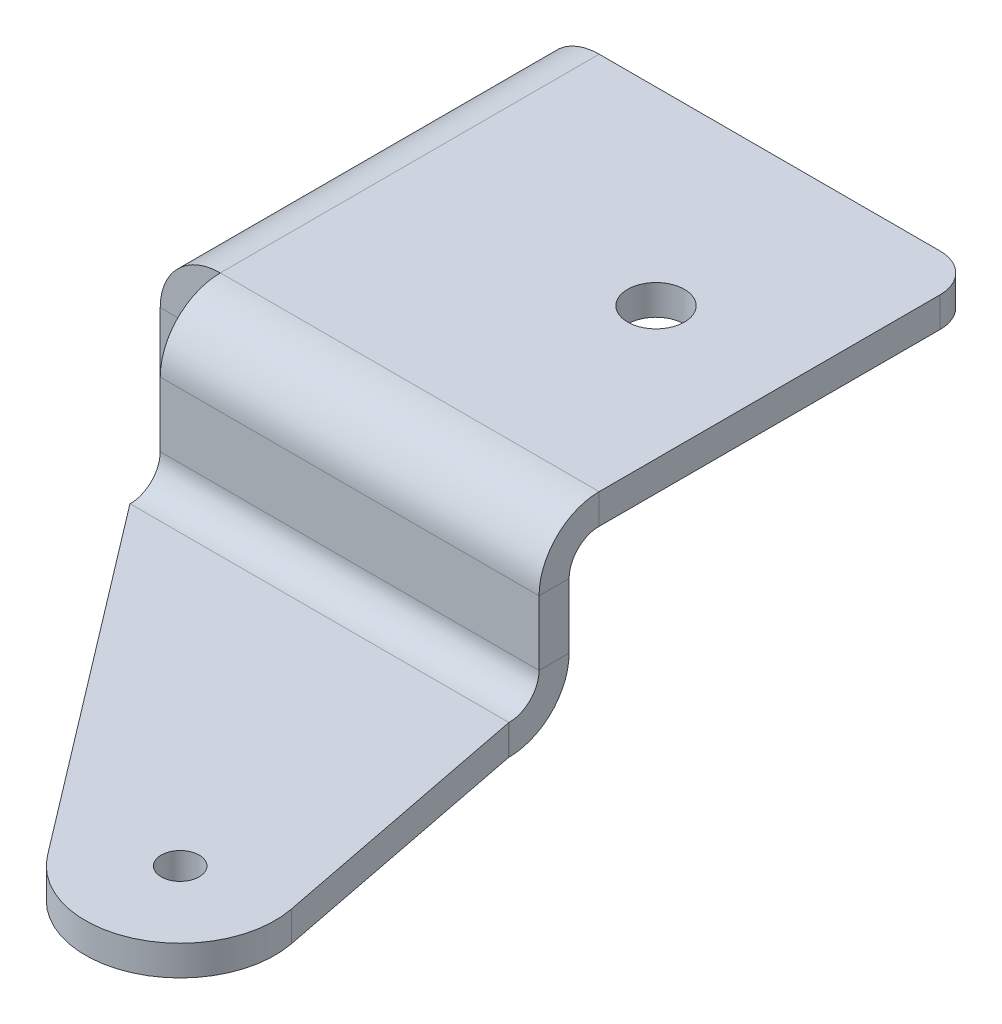
ISO-10303-21;
HEADER;
FILE_DESCRIPTION(('STEP AP214'),'2;1');
FILE_NAME('part.step','',(''),(''),'','','');
FILE_SCHEMA(('AUTOMOTIVE_DESIGN { 1 0 10303 214 1 1 1 1 }'));
ENDSEC;
DATA;
#1=APPLICATION_CONTEXT('core data for automotive mechanical design processes');
#2=APPLICATION_PROTOCOL_DEFINITION('international standard','automotive_design',2000,#1);
#3=PRODUCT_CONTEXT('',#1,'mechanical');
#4=PRODUCT('Part','Part','',(#3));
#5=PRODUCT_RELATED_PRODUCT_CATEGORY('part','',(#4));
#6=PRODUCT_DEFINITION_FORMATION('','',#4);
#7=PRODUCT_DEFINITION_CONTEXT('part definition',#1,'design');
#8=PRODUCT_DEFINITION('design','',#6,#7);
#9=PRODUCT_DEFINITION_SHAPE('','',#8);
#10=(LENGTH_UNIT() NAMED_UNIT(*) SI_UNIT(.MILLI.,.METRE.));
#11=(NAMED_UNIT(*) PLANE_ANGLE_UNIT() SI_UNIT($,.RADIAN.));
#12=(NAMED_UNIT(*) SI_UNIT($,.STERADIAN.) SOLID_ANGLE_UNIT());
#13=UNCERTAINTY_MEASURE_WITH_UNIT(LENGTH_MEASURE(1.E-05),#10,'distance_accuracy_value','');
#14=(GEOMETRIC_REPRESENTATION_CONTEXT(3) GLOBAL_UNCERTAINTY_ASSIGNED_CONTEXT((#13)) GLOBAL_UNIT_ASSIGNED_CONTEXT((#10,
#11,#12)) REPRESENTATION_CONTEXT('',''));
#15=CARTESIAN_POINT('',(0.,0.,0.));
#16=DIRECTION('',(0.,0.,1.));
#17=DIRECTION('',(1.,0.,0.));
#18=AXIS2_PLACEMENT_3D('',#15,#16,#17);
#19=CARTESIAN_POINT('',(20.,1.27,0.));
#20=DIRECTION('',(-1.,0.,0.));
#21=DIRECTION('',(0.,0.,-1.));
#22=AXIS2_PLACEMENT_3D('',#19,#20,#21);
#23=PLANE('',#22);
#24=DIRECTION('',(0.,0.,-1.));
#25=VECTOR('',#24,1.);
#26=CARTESIAN_POINT('',(20.,-0.3175,0.));
#27=LINE('',#26,#25);
#28=CARTESIAN_POINT('',(20.,-0.317499999999995,0.));
#29=VERTEX_POINT('',#28);
#30=CARTESIAN_POINT('',(20.,-0.3175,-18.));
#31=VERTEX_POINT('',#30);
#32=EDGE_CURVE('E489',#29,#31,#27,.T.);
#33=ORIENTED_EDGE('',*,*,#32,.T.);
#34=DIRECTION('',(0.,-1.,0.));
#35=VECTOR('',#34,1.);
#36=CARTESIAN_POINT('',(20.,1.27,-18.));
#37=LINE('',#36,#35);
#38=CARTESIAN_POINT('',(20.,1.27,-18.));
#39=VERTEX_POINT('',#38);
#40=EDGE_CURVE('E503',#31,#39,#37,.F.);
#41=ORIENTED_EDGE('',*,*,#40,.T.);
#42=DIRECTION('',(0.,0.,-1.));
#43=VECTOR('',#42,1.);
#44=CARTESIAN_POINT('',(20.,1.27,0.));
#45=LINE('',#44,#43);
#46=CARTESIAN_POINT('',(20.,1.27,0.));
#47=VERTEX_POINT('',#46);
#48=EDGE_CURVE('E471',#47,#39,#45,.T.);
#49=ORIENTED_EDGE('',*,*,#48,.F.);
#50=DIRECTION('',(0.,1.,0.));
#51=VECTOR('',#50,1.);
#52=CARTESIAN_POINT('',(20.,1.27,0.));
#53=LINE('',#52,#51);
#54=EDGE_CURVE('E499',#29,#47,#53,.T.);
#55=ORIENTED_EDGE('',*,*,#54,.F.);
#56=EDGE_LOOP('',(#33,#41,#49,#55));
#57=FACE_BOUND('',#56,.T.);
#58=ADVANCED_FACE('F109',(#57),#23,.F.);
#59=CARTESIAN_POINT('',(0.,1.27,-20.));
#60=DIRECTION('',(0.,0.,1.));
#61=DIRECTION('',(-1.,0.,0.));
#62=AXIS2_PLACEMENT_3D('',#59,#60,#61);
#63=PLANE('',#62);
#64=DIRECTION('',(-1.,0.,0.));
#65=VECTOR('',#64,1.);
#66=CARTESIAN_POINT('',(0.,1.27,-20.));
#67=LINE('',#66,#65);
#68=CARTESIAN_POINT('',(18.,1.27,-20.));
#69=VERTEX_POINT('',#68);
#70=CARTESIAN_POINT('',(0.,1.27,-20.));
#71=VERTEX_POINT('',#70);
#72=EDGE_CURVE('E475',#69,#71,#67,.T.);
#73=ORIENTED_EDGE('',*,*,#72,.F.);
#74=DIRECTION('',(0.,-1.,0.));
#75=VECTOR('',#74,1.);
#76=CARTESIAN_POINT('',(18.,1.27,-20.));
#77=LINE('',#76,#75);
#78=CARTESIAN_POINT('',(18.,-0.3175,-20.));
#79=VERTEX_POINT('',#78);
#80=EDGE_CURVE('E513',#69,#79,#77,.T.);
#81=ORIENTED_EDGE('',*,*,#80,.T.);
#82=DIRECTION('',(1.,0.,0.));
#83=VECTOR('',#82,1.);
#84=CARTESIAN_POINT('',(0.,-0.3175,-20.));
#85=LINE('',#84,#83);
#86=CARTESIAN_POINT('',(0.,-0.317499999999999,-20.));
#87=VERTEX_POINT('',#86);
#88=EDGE_CURVE('E463',#79,#87,#85,.F.);
#89=ORIENTED_EDGE('',*,*,#88,.T.);
#90=DIRECTION('',(0.,1.,0.));
#91=VECTOR('',#90,1.);
#92=CARTESIAN_POINT('',(0.,1.27,-20.));
#93=LINE('',#92,#91);
#94=EDGE_CURVE('E495',#87,#71,#93,.T.);
#95=ORIENTED_EDGE('',*,*,#94,.T.);
#96=EDGE_LOOP('',(#73,#81,#89,#95));
#97=FACE_BOUND('',#96,.T.);
#98=ADVANCED_FACE('F668',(#97),#63,.F.);
#99=CARTESIAN_POINT('',(13.,1.27,-10.));
#100=DIRECTION('',(0.,-1.,0.));
#101=DIRECTION('',(0.,0.,-1.));
#102=AXIS2_PLACEMENT_3D('',#99,#100,#101);
#103=CYLINDRICAL_SURFACE('',#102,1.5);
#104=CARTESIAN_POINT('',(13.,1.27,-10.));
#105=DIRECTION('',(0.,1.,0.));
#106=DIRECTION('',(0.,0.,1.));
#107=AXIS2_PLACEMENT_3D('',#104,#105,#106);
#108=CIRCLE('',#107,1.5);
#109=CARTESIAN_POINT('',(13.,1.27,-8.5));
#110=VERTEX_POINT('',#109);
#111=EDGE_CURVE('E458',#110,#110,#108,.T.);
#112=ORIENTED_EDGE('',*,*,#111,.T.);
#113=EDGE_LOOP('',(#112));
#114=FACE_BOUND('',#113,.T.);
#115=CARTESIAN_POINT('',(13.,-0.3175,-10.));
#116=DIRECTION('',(0.,1.,0.));
#117=DIRECTION('',(0.,0.,1.));
#118=AXIS2_PLACEMENT_3D('',#115,#116,#117);
#119=CIRCLE('',#118,1.5);
#120=CARTESIAN_POINT('',(13.,-0.3175,-8.5));
#121=VERTEX_POINT('',#120);
#122=EDGE_CURVE('E446',#121,#121,#119,.T.);
#123=ORIENTED_EDGE('',*,*,#122,.F.);
#124=EDGE_LOOP('',(#123));
#125=FACE_BOUND('',#124,.T.);
#126=ADVANCED_FACE('F674',(#114,#125),#103,.F.);
#127=CARTESIAN_POINT('',(0.,1.27,0.));
#128=DIRECTION('',(0.,-1.,0.));
#129=DIRECTION('',(0.,0.,-1.));
#130=AXIS2_PLACEMENT_3D('',#127,#128,#129);
#131=PLANE('',#130);
#132=ORIENTED_EDGE('',*,*,#111,.F.);
#133=EDGE_LOOP('',(#132));
#134=FACE_BOUND('',#133,.T.);
#135=ORIENTED_EDGE('',*,*,#48,.T.);
#136=CARTESIAN_POINT('',(18.,1.27,-18.));
#137=DIRECTION('',(0.,-1.,0.));
#138=DIRECTION('',(0.,0.,-1.));
#139=AXIS2_PLACEMENT_3D('',#136,#137,#138);
#140=CIRCLE('',#139,2.);
#141=EDGE_CURVE('E510',#39,#69,#140,.F.);
#142=ORIENTED_EDGE('',*,*,#141,.T.);
#143=ORIENTED_EDGE('',*,*,#72,.T.);
#144=DIRECTION('',(0.,0.,1.));
#145=VECTOR('',#144,1.);
#146=CARTESIAN_POINT('',(0.,1.27,0.));
#147=LINE('',#146,#145);
#148=CARTESIAN_POINT('',(0.,1.27000000000001,0.));
#149=VERTEX_POINT('',#148);
#150=EDGE_CURVE('E462',#71,#149,#147,.T.);
#151=ORIENTED_EDGE('',*,*,#150,.T.);
#152=DIRECTION('',(1.,0.,0.));
#153=VECTOR('',#152,1.);
#154=CARTESIAN_POINT('',(0.,1.27,0.));
#155=LINE('',#154,#153);
#156=EDGE_CURVE('E467',#149,#47,#155,.T.);
#157=ORIENTED_EDGE('',*,*,#156,.T.);
#158=EDGE_LOOP('',(#135,#142,#143,#151,#157));
#159=FACE_BOUND('',#158,.T.);
#160=ADVANCED_FACE('F589',(#134,#159),#131,.F.);
#161=CARTESIAN_POINT('',(0.,-0.3175,0.));
#162=DIRECTION('',(0.,-1.,0.));
#163=DIRECTION('',(0.,0.,-1.));
#164=AXIS2_PLACEMENT_3D('',#161,#162,#163);
#165=PLANE('',#164);
#166=ORIENTED_EDGE('',*,*,#122,.T.);
#167=EDGE_LOOP('',(#166));
#168=FACE_BOUND('',#167,.T.);
#169=ORIENTED_EDGE('',*,*,#88,.F.);
#170=CARTESIAN_POINT('',(18.,-0.3175,-18.));
#171=DIRECTION('',(0.,-1.,0.));
#172=DIRECTION('',(0.,0.,-1.));
#173=AXIS2_PLACEMENT_3D('',#170,#171,#172);
#174=CIRCLE('',#173,2.);
#175=EDGE_CURVE('E516',#79,#31,#174,.T.);
#176=ORIENTED_EDGE('',*,*,#175,.T.);
#177=ORIENTED_EDGE('',*,*,#32,.F.);
#178=DIRECTION('',(1.,0.,0.));
#179=VECTOR('',#178,1.);
#180=CARTESIAN_POINT('',(0.,-0.3175,0.));
#181=LINE('',#180,#179);
#182=CARTESIAN_POINT('',(0.,-0.317499999999995,0.));
#183=VERTEX_POINT('',#182);
#184=EDGE_CURVE('E486',#183,#29,#181,.T.);
#185=ORIENTED_EDGE('',*,*,#184,.F.);
#186=DIRECTION('',(0.,0.,-1.));
#187=VECTOR('',#186,1.);
#188=CARTESIAN_POINT('',(0.,-0.3175,0.));
#189=LINE('',#188,#187);
#190=EDGE_CURVE('E482',#87,#183,#189,.F.);
#191=ORIENTED_EDGE('',*,*,#190,.F.);
#192=EDGE_LOOP('',(#169,#176,#177,#185,#191));
#193=FACE_BOUND('',#192,.T.);
#194=ADVANCED_FACE('F576',(#168,#193),#165,.T.);
#195=CARTESIAN_POINT('',(0.,-1.905,0.));
#196=DIRECTION('',(0.,0.,1.));
#197=DIRECTION('',(1.,0.,0.));
#198=AXIS2_PLACEMENT_3D('',#195,#196,#197);
#199=PLANE('',#198);
#200=DIRECTION('',(1.,0.,0.));
#201=VECTOR('',#200,1.);
#202=CARTESIAN_POINT('',(-3.175,-1.90499999999999,0.));
#203=LINE('',#202,#201);
#204=CARTESIAN_POINT('',(-1.5875,-1.90499999999999,0.));
#205=VERTEX_POINT('',#204);
#206=CARTESIAN_POINT('',(-3.175,-1.90499999999999,0.));
#207=VERTEX_POINT('',#206);
#208=EDGE_CURVE('E407',#205,#207,#203,.F.);
#209=ORIENTED_EDGE('',*,*,#208,.F.);
#210=CARTESIAN_POINT('',(0.,-1.905,0.));
#211=DIRECTION('',(0.,0.,-1.));
#212=DIRECTION('',(-1.,0.,0.));
#213=AXIS2_PLACEMENT_3D('',#210,#211,#212);
#214=CIRCLE('',#213,1.5875);
#215=EDGE_CURVE('E451',#183,#205,#214,.F.);
#216=ORIENTED_EDGE('',*,*,#215,.F.);
#217=DIRECTION('',(0.,1.,0.));
#218=VECTOR('',#217,1.);
#219=CARTESIAN_POINT('',(0.,1.27,0.));
#220=LINE('',#219,#218);
#221=EDGE_CURVE('E478',#183,#149,#220,.T.);
#222=ORIENTED_EDGE('',*,*,#221,.T.);
#223=CARTESIAN_POINT('',(0.,-1.905,0.));
#224=DIRECTION('',(0.,0.,-1.));
#225=DIRECTION('',(-1.,0.,0.));
#226=AXIS2_PLACEMENT_3D('',#223,#224,#225);
#227=CIRCLE('',#226,3.175);
#228=EDGE_CURVE('E442',#149,#207,#227,.F.);
#229=ORIENTED_EDGE('',*,*,#228,.T.);
#230=EDGE_LOOP('',(#209,#216,#222,#229));
#231=FACE_BOUND('',#230,.T.);
#232=ADVANCED_FACE('F563',(#231),#199,.T.);
#233=CARTESIAN_POINT('',(0.,-1.905,-20.));
#234=DIRECTION('',(0.,0.,1.));
#235=DIRECTION('',(1.,0.,0.));
#236=AXIS2_PLACEMENT_3D('',#233,#234,#235);
#237=PLANE('',#236);
#238=CARTESIAN_POINT('',(0.,-1.905,-20.));
#239=DIRECTION('',(0.,0.,-1.));
#240=DIRECTION('',(-1.,0.,0.));
#241=AXIS2_PLACEMENT_3D('',#238,#239,#240);
#242=CIRCLE('',#241,1.5875);
#243=CARTESIAN_POINT('',(-1.5875,-1.90499999999999,-20.));
#244=VERTEX_POINT('',#243);
#245=EDGE_CURVE('E411',#244,#87,#242,.T.);
#246=ORIENTED_EDGE('',*,*,#245,.F.);
#247=DIRECTION('',(1.,0.,0.));
#248=VECTOR('',#247,1.);
#249=CARTESIAN_POINT('',(-1.5875,-1.90499999999999,-20.));
#250=LINE('',#249,#248);
#251=CARTESIAN_POINT('',(-3.175,-1.90499999999999,-20.));
#252=VERTEX_POINT('',#251);
#253=EDGE_CURVE('E432',#244,#252,#250,.F.);
#254=ORIENTED_EDGE('',*,*,#253,.T.);
#255=CARTESIAN_POINT('',(0.,-1.905,-20.));
#256=DIRECTION('',(0.,0.,-1.));
#257=DIRECTION('',(-1.,0.,0.));
#258=AXIS2_PLACEMENT_3D('',#255,#256,#257);
#259=CIRCLE('',#258,3.175);
#260=EDGE_CURVE('E447',#252,#71,#259,.T.);
#261=ORIENTED_EDGE('',*,*,#260,.T.);
#262=ORIENTED_EDGE('',*,*,#94,.F.);
#263=EDGE_LOOP('',(#246,#254,#261,#262));
#264=FACE_BOUND('',#263,.T.);
#265=ADVANCED_FACE('F555',(#264),#237,.F.);
#266=CARTESIAN_POINT('',(0.,-1.905,-20.));
#267=DIRECTION('',(0.,0.,-1.));
#268=DIRECTION('',(-1.,0.,0.));
#269=AXIS2_PLACEMENT_3D('',#266,#267,#268);
#270=CYLINDRICAL_SURFACE('',#269,3.175);
#271=ORIENTED_EDGE('',*,*,#150,.F.);
#272=ORIENTED_EDGE('',*,*,#260,.F.);
#273=DIRECTION('',(0.,0.,-1.));
#274=VECTOR('',#273,1.);
#275=CARTESIAN_POINT('',(-3.175,-1.90499999999999,0.));
#276=LINE('',#275,#274);
#277=EDGE_CURVE('E428',#252,#207,#276,.F.);
#278=ORIENTED_EDGE('',*,*,#277,.T.);
#279=ORIENTED_EDGE('',*,*,#228,.F.);
#280=EDGE_LOOP('',(#271,#272,#278,#279));
#281=FACE_BOUND('',#280,.T.);
#282=ADVANCED_FACE('F560',(#281),#270,.T.);
#283=CARTESIAN_POINT('',(0.,-1.905,-20.));
#284=DIRECTION('',(0.,0.,-1.));
#285=DIRECTION('',(-1.,0.,0.));
#286=AXIS2_PLACEMENT_3D('',#283,#284,#285);
#287=CYLINDRICAL_SURFACE('',#286,1.5875);
#288=ORIENTED_EDGE('',*,*,#190,.T.);
#289=ORIENTED_EDGE('',*,*,#215,.T.);
#290=DIRECTION('',(0.,0.,-1.));
#291=VECTOR('',#290,1.);
#292=CARTESIAN_POINT('',(-1.5875,-1.90499999999999,0.));
#293=LINE('',#292,#291);
#294=EDGE_CURVE('E436',#205,#244,#293,.T.);
#295=ORIENTED_EDGE('',*,*,#294,.T.);
#296=ORIENTED_EDGE('',*,*,#245,.T.);
#297=EDGE_LOOP('',(#288,#289,#295,#296));
#298=FACE_BOUND('',#297,.T.);
#299=ADVANCED_FACE('F570',(#298),#287,.F.);
#300=CARTESIAN_POINT('',(-3.17500000000008,-24.455,-20.));
#301=DIRECTION('',(0.,0.,1.));
#302=DIRECTION('',(1.,0.,0.));
#303=AXIS2_PLACEMENT_3D('',#300,#301,#302);
#304=PLANE('',#303);
#305=DIRECTION('',(0.,1.,0.));
#306=VECTOR('',#305,1.);
#307=CARTESIAN_POINT('',(-1.58750000000008,-24.455,-20.));
#308=LINE('',#307,#306);
#309=CARTESIAN_POINT('',(-1.58750000000007,-22.455,-20.));
#310=VERTEX_POINT('',#309);
#311=EDGE_CURVE('E425',#244,#310,#308,.F.);
#312=ORIENTED_EDGE('',*,*,#311,.T.);
#313=DIRECTION('',(1.,0.,0.));
#314=VECTOR('',#313,1.);
#315=CARTESIAN_POINT('',(-3.17500000000007,-22.455,-20.));
#316=LINE('',#315,#314);
#317=CARTESIAN_POINT('',(-3.17500000000007,-22.455,-20.));
#318=VERTEX_POINT('',#317);
#319=EDGE_CURVE('E133',#310,#318,#316,.F.);
#320=ORIENTED_EDGE('',*,*,#319,.T.);
#321=DIRECTION('',(0.,-1.,0.));
#322=VECTOR('',#321,1.);
#323=CARTESIAN_POINT('',(-3.17499999999999,0.,-20.));
#324=LINE('',#323,#322);
#325=EDGE_CURVE('E415',#252,#318,#324,.T.);
#326=ORIENTED_EDGE('',*,*,#325,.F.);
#327=ORIENTED_EDGE('',*,*,#253,.F.);
#328=EDGE_LOOP('',(#312,#320,#326,#327));
#329=FACE_BOUND('',#328,.T.);
#330=ADVANCED_FACE('F552',(#329),#304,.F.);
#331=CARTESIAN_POINT('',(-3.17499999999999,-0.317499999999994,0.));
#332=DIRECTION('',(0.,0.,-1.));
#333=DIRECTION('',(-1.,0.,0.));
#334=AXIS2_PLACEMENT_3D('',#331,#332,#333);
#335=PLANE('',#334);
#336=DIRECTION('',(0.,1.,0.));
#337=VECTOR('',#336,1.);
#338=CARTESIAN_POINT('',(-3.17499999999999,0.,0.));
#339=LINE('',#338,#337);
#340=CARTESIAN_POINT('',(-3.17500000000007,-22.455,0.));
#341=VERTEX_POINT('',#340);
#342=EDGE_CURVE('E408',#341,#207,#339,.T.);
#343=ORIENTED_EDGE('',*,*,#342,.F.);
#344=DIRECTION('',(1.,0.,0.));
#345=VECTOR('',#344,1.);
#346=CARTESIAN_POINT('',(-3.17500000000007,-22.455,0.));
#347=LINE('',#346,#345);
#348=CARTESIAN_POINT('',(-1.58750000000007,-22.455,0.));
#349=VERTEX_POINT('',#348);
#350=EDGE_CURVE('E13',#341,#349,#347,.T.);
#351=ORIENTED_EDGE('',*,*,#350,.T.);
#352=DIRECTION('',(0.,-1.,0.));
#353=VECTOR('',#352,1.);
#354=CARTESIAN_POINT('',(-1.58749999999999,-0.3175,0.));
#355=LINE('',#354,#353);
#356=EDGE_CURVE('E418',#349,#205,#355,.F.);
#357=ORIENTED_EDGE('',*,*,#356,.T.);
#358=ORIENTED_EDGE('',*,*,#208,.T.);
#359=EDGE_LOOP('',(#343,#351,#357,#358));
#360=FACE_BOUND('',#359,.T.);
#361=ADVANCED_FACE('F566',(#360),#335,.F.);
#362=CARTESIAN_POINT('',(-3.17499999999999,0.,0.));
#363=DIRECTION('',(1.,0.,0.));
#364=DIRECTION('',(0.,1.,0.));
#365=AXIS2_PLACEMENT_3D('',#362,#363,#364);
#366=PLANE('',#365);
#367=CARTESIAN_POINT('',(-3.17500000000004,-13.18,-10.));
#368=DIRECTION('',(1.,0.,0.));
#369=DIRECTION('',(0.,1.,0.));
#370=AXIS2_PLACEMENT_3D('',#367,#368,#369);
#371=CIRCLE('',#370,6.25);
#372=CARTESIAN_POINT('',(-3.17500000000002,-6.92999999999999,-10.));
#373=VERTEX_POINT('',#372);
#374=EDGE_CURVE('E403',#373,#373,#371,.F.);
#375=ORIENTED_EDGE('',*,*,#374,.F.);
#376=EDGE_LOOP('',(#375));
#377=FACE_BOUND('',#376,.T.);
#378=ORIENTED_EDGE('',*,*,#325,.T.);
#379=CARTESIAN_POINT('',(-3.17500000000007,-22.455,-18.));
#380=DIRECTION('',(1.,0.,0.));
#381=DIRECTION('',(0.,1.,0.));
#382=AXIS2_PLACEMENT_3D('',#379,#380,#381);
#383=CIRCLE('',#382,2.);
#384=CARTESIAN_POINT('',(-3.17500000000008,-24.455,-18.));
#385=VERTEX_POINT('',#384);
#386=EDGE_CURVE('E118',#318,#385,#383,.F.);
#387=ORIENTED_EDGE('',*,*,#386,.T.);
#388=DIRECTION('',(0.,0.,1.));
#389=VECTOR('',#388,1.);
#390=CARTESIAN_POINT('',(-3.17500000000008,-24.455,0.));
#391=LINE('',#390,#389);
#392=CARTESIAN_POINT('',(-3.17500000000008,-24.455,-2.));
#393=VERTEX_POINT('',#392);
#394=EDGE_CURVE('E412',#385,#393,#391,.T.);
#395=ORIENTED_EDGE('',*,*,#394,.T.);
#396=CARTESIAN_POINT('',(-3.17500000000007,-22.455,-2.));
#397=DIRECTION('',(1.,0.,0.));
#398=DIRECTION('',(0.,1.,0.));
#399=AXIS2_PLACEMENT_3D('',#396,#397,#398);
#400=CIRCLE('',#399,2.);
#401=EDGE_CURVE('E125',#393,#341,#400,.F.);
#402=ORIENTED_EDGE('',*,*,#401,.T.);
#403=ORIENTED_EDGE('',*,*,#342,.T.);
#404=ORIENTED_EDGE('',*,*,#277,.F.);
#405=EDGE_LOOP('',(#378,#387,#395,#402,#403,#404));
#406=FACE_BOUND('',#405,.T.);
#407=ADVANCED_FACE('F538',(#377,#406),#366,.F.);
#408=CARTESIAN_POINT('',(-1.58749999999999,0.,0.));
#409=DIRECTION('',(1.,0.,0.));
#410=DIRECTION('',(0.,1.,0.));
#411=AXIS2_PLACEMENT_3D('',#408,#409,#410);
#412=PLANE('',#411);
#413=CARTESIAN_POINT('',(-1.58750000000004,-13.18,-10.));
#414=DIRECTION('',(1.,0.,0.));
#415=DIRECTION('',(0.,1.,0.));
#416=AXIS2_PLACEMENT_3D('',#413,#414,#415);
#417=CIRCLE('',#416,6.25);
#418=CARTESIAN_POINT('',(-1.58750000000002,-6.93,-10.));
#419=VERTEX_POINT('',#418);
#420=EDGE_CURVE('E388',#419,#419,#417,.T.);
#421=ORIENTED_EDGE('',*,*,#420,.F.);
#422=EDGE_LOOP('',(#421));
#423=FACE_BOUND('',#422,.T.);
#424=DIRECTION('',(0.,0.,-1.));
#425=VECTOR('',#424,1.);
#426=CARTESIAN_POINT('',(-1.58750000000008,-24.455,0.));
#427=LINE('',#426,#425);
#428=CARTESIAN_POINT('',(-1.58750000000008,-24.455,-18.));
#429=VERTEX_POINT('',#428);
#430=CARTESIAN_POINT('',(-1.58750000000008,-24.455,-2.));
#431=VERTEX_POINT('',#430);
#432=EDGE_CURVE('E421',#429,#431,#427,.F.);
#433=ORIENTED_EDGE('',*,*,#432,.F.);
#434=CARTESIAN_POINT('',(-1.58750000000007,-22.455,-18.));
#435=DIRECTION('',(1.,0.,0.));
#436=DIRECTION('',(0.,1.,0.));
#437=AXIS2_PLACEMENT_3D('',#434,#435,#436);
#438=CIRCLE('',#437,2.);
#439=EDGE_CURVE('E529',#429,#310,#438,.T.);
#440=ORIENTED_EDGE('',*,*,#439,.T.);
#441=ORIENTED_EDGE('',*,*,#311,.F.);
#442=ORIENTED_EDGE('',*,*,#294,.F.);
#443=ORIENTED_EDGE('',*,*,#356,.F.);
#444=CARTESIAN_POINT('',(-1.58750000000007,-22.455,-2.));
#445=DIRECTION('',(1.,0.,0.));
#446=DIRECTION('',(0.,1.,0.));
#447=AXIS2_PLACEMENT_3D('',#444,#445,#446);
#448=CIRCLE('',#447,2.);
#449=EDGE_CURVE('E526',#349,#431,#448,.T.);
#450=ORIENTED_EDGE('',*,*,#449,.T.);
#451=EDGE_LOOP('',(#433,#440,#441,#442,#443,#450));
#452=FACE_BOUND('',#451,.T.);
#453=ADVANCED_FACE('F549',(#423,#452),#412,.T.);
#454=CARTESIAN_POINT('',(-3.17500000000008,-24.455,0.));
#455=DIRECTION('',(0.,1.,0.));
#456=DIRECTION('',(-1.,0.,0.));
#457=AXIS2_PLACEMENT_3D('',#454,#455,#456);
#458=PLANE('',#457);
#459=ORIENTED_EDGE('',*,*,#394,.F.);
#460=DIRECTION('',(1.,0.,0.));
#461=VECTOR('',#460,1.);
#462=CARTESIAN_POINT('',(-3.17500000000008,-24.455,-18.));
#463=LINE('',#462,#461);
#464=EDGE_CURVE('E522',#385,#429,#463,.T.);
#465=ORIENTED_EDGE('',*,*,#464,.T.);
#466=ORIENTED_EDGE('',*,*,#432,.T.);
#467=DIRECTION('',(1.,0.,0.));
#468=VECTOR('',#467,1.);
#469=CARTESIAN_POINT('',(-3.17500000000008,-24.455,-2.));
#470=LINE('',#469,#468);
#471=EDGE_CURVE('E519',#431,#393,#470,.F.);
#472=ORIENTED_EDGE('',*,*,#471,.T.);
#473=EDGE_LOOP('',(#459,#465,#466,#472));
#474=FACE_BOUND('',#473,.T.);
#475=ADVANCED_FACE('F543',(#474),#458,.F.);
#476=CARTESIAN_POINT('',(-3.17600000000013,-13.18,-10.));
#477=DIRECTION('',(1.,0.,0.));
#478=DIRECTION('',(0.,1.,0.));
#479=AXIS2_PLACEMENT_3D('',#476,#477,#478);
#480=CYLINDRICAL_SURFACE('',#479,6.25);
#481=ORIENTED_EDGE('',*,*,#420,.T.);
#482=EDGE_LOOP('',(#481));
#483=FACE_BOUND('',#482,.T.);
#484=ORIENTED_EDGE('',*,*,#374,.T.);
#485=EDGE_LOOP('',(#484));
#486=FACE_BOUND('',#485,.T.);
#487=ADVANCED_FACE('F861',(#483,#486),#480,.F.);
#488=CARTESIAN_POINT('',(20.,-1.90499999999999,0.));
#489=DIRECTION('',(1.,0.,0.));
#490=DIRECTION('',(0.,0.,-1.));
#491=AXIS2_PLACEMENT_3D('',#488,#489,#490);
#492=PLANE('',#491);
#493=DIRECTION('',(0.,0.,-1.));
#494=VECTOR('',#493,1.);
#495=CARTESIAN_POINT('',(20.,-1.90499999999999,3.17499999999999));
#496=LINE('',#495,#494);
#497=CARTESIAN_POINT('',(20.,-1.90499999999999,1.5875));
#498=VERTEX_POINT('',#497);
#499=CARTESIAN_POINT('',(20.,-1.90499999999998,3.175));
#500=VERTEX_POINT('',#499);
#501=EDGE_CURVE('E329',#498,#500,#496,.F.);
#502=ORIENTED_EDGE('',*,*,#501,.F.);
#503=CARTESIAN_POINT('',(20.,-1.90499999999999,0.));
#504=DIRECTION('',(-1.,0.,0.));
#505=DIRECTION('',(0.,0.,1.));
#506=AXIS2_PLACEMENT_3D('',#503,#504,#505);
#507=CIRCLE('',#506,1.5875);
#508=EDGE_CURVE('E393',#29,#498,#507,.F.);
#509=ORIENTED_EDGE('',*,*,#508,.F.);
#510=ORIENTED_EDGE('',*,*,#54,.T.);
#511=CARTESIAN_POINT('',(20.,-1.90499999999999,0.));
#512=DIRECTION('',(-1.,0.,0.));
#513=DIRECTION('',(0.,0.,1.));
#514=AXIS2_PLACEMENT_3D('',#511,#512,#513);
#515=CIRCLE('',#514,3.175);
#516=EDGE_CURVE('E384',#47,#500,#515,.F.);
#517=ORIENTED_EDGE('',*,*,#516,.T.);
#518=EDGE_LOOP('',(#502,#509,#510,#517));
#519=FACE_BOUND('',#518,.T.);
#520=ADVANCED_FACE('F584',(#519),#492,.T.);
#521=CARTESIAN_POINT('',(0.,-1.90499999999999,0.));
#522=DIRECTION('',(1.,0.,0.));
#523=DIRECTION('',(0.,0.,-1.));
#524=AXIS2_PLACEMENT_3D('',#521,#522,#523);
#525=PLANE('',#524);
#526=CARTESIAN_POINT('',(0.,-1.90499999999999,0.));
#527=DIRECTION('',(-1.,0.,0.));
#528=DIRECTION('',(0.,0.,1.));
#529=AXIS2_PLACEMENT_3D('',#526,#527,#528);
#530=CIRCLE('',#529,1.5875);
#531=CARTESIAN_POINT('',(0.,-1.90499999999999,1.5875));
#532=VERTEX_POINT('',#531);
#533=EDGE_CURVE('E345',#532,#183,#530,.T.);
#534=ORIENTED_EDGE('',*,*,#533,.F.);
#535=DIRECTION('',(0.,0.,-1.));
#536=VECTOR('',#535,1.);
#537=CARTESIAN_POINT('',(0.,-1.90499999999999,1.5875));
#538=LINE('',#537,#536);
#539=CARTESIAN_POINT('',(0.,-1.90499999999999,3.175));
#540=VERTEX_POINT('',#539);
#541=EDGE_CURVE('E374',#532,#540,#538,.F.);
#542=ORIENTED_EDGE('',*,*,#541,.T.);
#543=CARTESIAN_POINT('',(0.,-1.90499999999999,0.));
#544=DIRECTION('',(-1.,0.,0.));
#545=DIRECTION('',(0.,0.,1.));
#546=AXIS2_PLACEMENT_3D('',#543,#544,#545);
#547=CIRCLE('',#546,3.175);
#548=EDGE_CURVE('E389',#540,#149,#547,.T.);
#549=ORIENTED_EDGE('',*,*,#548,.T.);
#550=ORIENTED_EDGE('',*,*,#221,.F.);
#551=EDGE_LOOP('',(#534,#542,#549,#550));
#552=FACE_BOUND('',#551,.T.);
#553=ADVANCED_FACE('F594',(#552),#525,.F.);
#554=CARTESIAN_POINT('',(0.,-1.90499999999999,0.));
#555=DIRECTION('',(-1.,0.,0.));
#556=DIRECTION('',(0.,0.,1.));
#557=AXIS2_PLACEMENT_3D('',#554,#555,#556);
#558=CYLINDRICAL_SURFACE('',#557,3.175);
#559=ORIENTED_EDGE('',*,*,#156,.F.);
#560=ORIENTED_EDGE('',*,*,#548,.F.);
#561=DIRECTION('',(-1.,0.,0.));
#562=VECTOR('',#561,1.);
#563=CARTESIAN_POINT('',(20.,-1.90499999999999,3.175));
#564=LINE('',#563,#562);
#565=EDGE_CURVE('E371',#540,#500,#564,.F.);
#566=ORIENTED_EDGE('',*,*,#565,.T.);
#567=ORIENTED_EDGE('',*,*,#516,.F.);
#568=EDGE_LOOP('',(#559,#560,#566,#567));
#569=FACE_BOUND('',#568,.T.);
#570=ADVANCED_FACE('F592',(#569),#558,.T.);
#571=CARTESIAN_POINT('',(0.,-1.90499999999999,0.));
#572=DIRECTION('',(-1.,0.,0.));
#573=DIRECTION('',(0.,0.,1.));
#574=AXIS2_PLACEMENT_3D('',#571,#572,#573);
#575=CYLINDRICAL_SURFACE('',#574,1.5875);
#576=ORIENTED_EDGE('',*,*,#184,.T.);
#577=ORIENTED_EDGE('',*,*,#508,.T.);
#578=DIRECTION('',(-1.,0.,0.));
#579=VECTOR('',#578,1.);
#580=CARTESIAN_POINT('',(20.,-1.90499999999999,1.5875));
#581=LINE('',#580,#579);
#582=EDGE_CURVE('E378',#498,#532,#581,.T.);
#583=ORIENTED_EDGE('',*,*,#582,.T.);
#584=ORIENTED_EDGE('',*,*,#533,.T.);
#585=EDGE_LOOP('',(#576,#577,#583,#584));
#586=FACE_BOUND('',#585,.T.);
#587=ADVANCED_FACE('F579',(#586),#575,.F.);
#588=CARTESIAN_POINT('',(0.,-5.31749999999999,3.17500000000001));
#589=DIRECTION('',(1.,0.,0.));
#590=DIRECTION('',(0.,1.,0.));
#591=AXIS2_PLACEMENT_3D('',#588,#589,#590);
#592=PLANE('',#591);
#593=ORIENTED_EDGE('',*,*,#541,.F.);
#594=DIRECTION('',(0.,1.,0.));
#595=VECTOR('',#594,1.);
#596=CARTESIAN_POINT('',(0.,-5.3175,1.58750000000001));
#597=LINE('',#596,#595);
#598=CARTESIAN_POINT('',(0.,-5.3175,1.58750000000001));
#599=VERTEX_POINT('',#598);
#600=EDGE_CURVE('E368',#532,#599,#597,.F.);
#601=ORIENTED_EDGE('',*,*,#600,.T.);
#602=DIRECTION('',(0.,0.,-1.));
#603=VECTOR('',#602,1.);
#604=CARTESIAN_POINT('',(0.,-5.31749999999999,3.17500000000001));
#605=LINE('',#604,#603);
#606=CARTESIAN_POINT('',(0.,-5.31749999999999,3.17500000000001));
#607=VERTEX_POINT('',#606);
#608=EDGE_CURVE('E341',#607,#599,#605,.T.);
#609=ORIENTED_EDGE('',*,*,#608,.F.);
#610=DIRECTION('',(0.,-1.,0.));
#611=VECTOR('',#610,1.);
#612=CARTESIAN_POINT('',(0.,0.,3.17499999999999));
#613=LINE('',#612,#611);
#614=EDGE_CURVE('E357',#540,#607,#613,.T.);
#615=ORIENTED_EDGE('',*,*,#614,.F.);
#616=EDGE_LOOP('',(#593,#601,#609,#615));
#617=FACE_BOUND('',#616,.T.);
#618=ADVANCED_FACE('F604',(#617),#592,.F.);
#619=CARTESIAN_POINT('',(20.,-0.317499999999994,3.17499999999999));
#620=DIRECTION('',(-1.,0.,0.));
#621=DIRECTION('',(0.,0.,1.));
#622=AXIS2_PLACEMENT_3D('',#619,#620,#621);
#623=PLANE('',#622);
#624=ORIENTED_EDGE('',*,*,#501,.T.);
#625=DIRECTION('',(0.,1.,0.));
#626=VECTOR('',#625,1.);
#627=CARTESIAN_POINT('',(20.,0.,3.17499999999999));
#628=LINE('',#627,#626);
#629=CARTESIAN_POINT('',(20.,-5.31749999999999,3.17500000000001));
#630=VERTEX_POINT('',#629);
#631=EDGE_CURVE('E350',#630,#500,#628,.T.);
#632=ORIENTED_EDGE('',*,*,#631,.F.);
#633=DIRECTION('',(0.,0.,-1.));
#634=VECTOR('',#633,1.);
#635=CARTESIAN_POINT('',(20.,-5.31749999999999,3.17500000000001));
#636=LINE('',#635,#634);
#637=CARTESIAN_POINT('',(20.,-5.3175,1.58750000000001));
#638=VERTEX_POINT('',#637);
#639=EDGE_CURVE('E346',#630,#638,#636,.T.);
#640=ORIENTED_EDGE('',*,*,#639,.T.);
#641=DIRECTION('',(0.,-1.,0.));
#642=VECTOR('',#641,1.);
#643=CARTESIAN_POINT('',(20.,-0.3175,1.58749999999999));
#644=LINE('',#643,#642);
#645=EDGE_CURVE('E360',#638,#498,#644,.F.);
#646=ORIENTED_EDGE('',*,*,#645,.T.);
#647=EDGE_LOOP('',(#624,#632,#640,#646));
#648=FACE_BOUND('',#647,.T.);
#649=ADVANCED_FACE('F654',(#648),#623,.F.);
#650=CARTESIAN_POINT('',(0.,0.,3.17499999999999));
#651=DIRECTION('',(0.,0.,-1.));
#652=DIRECTION('',(0.,1.,0.));
#653=AXIS2_PLACEMENT_3D('',#650,#651,#652);
#654=PLANE('',#653);
#655=ORIENTED_EDGE('',*,*,#565,.F.);
#656=ORIENTED_EDGE('',*,*,#614,.T.);
#657=DIRECTION('',(1.,0.,0.));
#658=VECTOR('',#657,1.);
#659=CARTESIAN_POINT('',(0.,-5.31749999999999,3.17500000000001));
#660=LINE('',#659,#658);
#661=EDGE_CURVE('E354',#607,#630,#660,.T.);
#662=ORIENTED_EDGE('',*,*,#661,.T.);
#663=ORIENTED_EDGE('',*,*,#631,.T.);
#664=EDGE_LOOP('',(#655,#656,#662,#663));
#665=FACE_BOUND('',#664,.T.);
#666=ADVANCED_FACE('F601',(#665),#654,.F.);
#667=CARTESIAN_POINT('',(0.,0.,1.58749999999999));
#668=DIRECTION('',(0.,0.,-1.));
#669=DIRECTION('',(0.,1.,0.));
#670=AXIS2_PLACEMENT_3D('',#667,#668,#669);
#671=PLANE('',#670);
#672=ORIENTED_EDGE('',*,*,#600,.F.);
#673=ORIENTED_EDGE('',*,*,#582,.F.);
#674=ORIENTED_EDGE('',*,*,#645,.F.);
#675=DIRECTION('',(-1.,0.,0.));
#676=VECTOR('',#675,1.);
#677=CARTESIAN_POINT('',(20.,-5.3175,1.58750000000001));
#678=LINE('',#677,#676);
#679=EDGE_CURVE('E364',#599,#638,#678,.F.);
#680=ORIENTED_EDGE('',*,*,#679,.F.);
#681=EDGE_LOOP('',(#672,#673,#674,#680));
#682=FACE_BOUND('',#681,.T.);
#683=ADVANCED_FACE('F657',(#682),#671,.T.);
#684=CARTESIAN_POINT('',(0.,-5.31749999999999,4.76250000000001));
#685=DIRECTION('',(-1.,0.,0.));
#686=DIRECTION('',(0.,0.,1.));
#687=AXIS2_PLACEMENT_3D('',#684,#685,#686);
#688=PLANE('',#687);
#689=DIRECTION('',(0.,1.,0.));
#690=VECTOR('',#689,1.);
#691=CARTESIAN_POINT('',(0.,-8.49249999999999,4.76250000000001));
#692=LINE('',#691,#690);
#693=CARTESIAN_POINT('',(0.,-6.90499999999999,4.76250000000001));
#694=VERTEX_POINT('',#693);
#695=CARTESIAN_POINT('',(0.,-8.49249999999999,4.76250000000001));
#696=VERTEX_POINT('',#695);
#697=EDGE_CURVE('E270',#694,#696,#692,.F.);
#698=ORIENTED_EDGE('',*,*,#697,.F.);
#699=CARTESIAN_POINT('',(0.,-5.31749999999999,4.76250000000001));
#700=DIRECTION('',(1.,0.,0.));
#701=DIRECTION('',(0.,0.,-1.));
#702=AXIS2_PLACEMENT_3D('',#699,#700,#701);
#703=CIRCLE('',#702,1.5875);
#704=EDGE_CURVE('E334',#607,#694,#703,.F.);
#705=ORIENTED_EDGE('',*,*,#704,.F.);
#706=ORIENTED_EDGE('',*,*,#608,.T.);
#707=CARTESIAN_POINT('',(0.,-5.31749999999999,4.76250000000001));
#708=DIRECTION('',(1.,0.,0.));
#709=DIRECTION('',(0.,0.,-1.));
#710=AXIS2_PLACEMENT_3D('',#707,#708,#709);
#711=CIRCLE('',#710,3.175);
#712=EDGE_CURVE('E325',#599,#696,#711,.F.);
#713=ORIENTED_EDGE('',*,*,#712,.T.);
#714=EDGE_LOOP('',(#698,#705,#706,#713));
#715=FACE_BOUND('',#714,.T.);
#716=ADVANCED_FACE('F614',(#715),#688,.T.);
#717=CARTESIAN_POINT('',(20.,-5.31749999999999,4.76250000000001));
#718=DIRECTION('',(-1.,0.,0.));
#719=DIRECTION('',(0.,0.,1.));
#720=AXIS2_PLACEMENT_3D('',#717,#718,#719);
#721=PLANE('',#720);
#722=CARTESIAN_POINT('',(20.,-5.31749999999999,4.76250000000001));
#723=DIRECTION('',(1.,0.,0.));
#724=DIRECTION('',(0.,0.,-1.));
#725=AXIS2_PLACEMENT_3D('',#722,#723,#724);
#726=CIRCLE('',#725,1.5875);
#727=CARTESIAN_POINT('',(20.,-6.90499999999999,4.76250000000001));
#728=VERTEX_POINT('',#727);
#729=EDGE_CURVE('E296',#728,#630,#726,.T.);
#730=ORIENTED_EDGE('',*,*,#729,.F.);
#731=DIRECTION('',(0.,1.,0.));
#732=VECTOR('',#731,1.);
#733=CARTESIAN_POINT('',(20.,-6.90499999999999,4.76250000000001));
#734=LINE('',#733,#732);
#735=CARTESIAN_POINT('',(20.,-8.49249999999999,4.76250000000001));
#736=VERTEX_POINT('',#735);
#737=EDGE_CURVE('E315',#728,#736,#734,.F.);
#738=ORIENTED_EDGE('',*,*,#737,.T.);
#739=CARTESIAN_POINT('',(20.,-5.31749999999999,4.76250000000001));
#740=DIRECTION('',(1.,0.,0.));
#741=DIRECTION('',(0.,0.,-1.));
#742=AXIS2_PLACEMENT_3D('',#739,#740,#741);
#743=CIRCLE('',#742,3.175);
#744=EDGE_CURVE('E330',#736,#638,#743,.T.);
#745=ORIENTED_EDGE('',*,*,#744,.T.);
#746=ORIENTED_EDGE('',*,*,#639,.F.);
#747=EDGE_LOOP('',(#730,#738,#745,#746));
#748=FACE_BOUND('',#747,.T.);
#749=ADVANCED_FACE('F652',(#748),#721,.F.);
#750=CARTESIAN_POINT('',(20.,-5.31749999999999,4.76250000000001));
#751=DIRECTION('',(1.,0.,0.));
#752=DIRECTION('',(0.,-1.,0.));
#753=AXIS2_PLACEMENT_3D('',#750,#751,#752);
#754=CYLINDRICAL_SURFACE('',#753,3.175);
#755=ORIENTED_EDGE('',*,*,#679,.T.);
#756=ORIENTED_EDGE('',*,*,#744,.F.);
#757=DIRECTION('',(1.,0.,0.));
#758=VECTOR('',#757,1.);
#759=CARTESIAN_POINT('',(0.,-8.49249999999999,4.76250000000001));
#760=LINE('',#759,#758);
#761=EDGE_CURVE('E312',#736,#696,#760,.F.);
#762=ORIENTED_EDGE('',*,*,#761,.T.);
#763=ORIENTED_EDGE('',*,*,#712,.F.);
#764=EDGE_LOOP('',(#755,#756,#762,#763));
#765=FACE_BOUND('',#764,.T.);
#766=ADVANCED_FACE('F655',(#765),#754,.T.);
#767=CARTESIAN_POINT('',(20.,-5.31749999999999,4.76250000000001));
#768=DIRECTION('',(1.,0.,0.));
#769=DIRECTION('',(0.,-1.,0.));
#770=AXIS2_PLACEMENT_3D('',#767,#768,#769);
#771=CYLINDRICAL_SURFACE('',#770,1.5875);
#772=ORIENTED_EDGE('',*,*,#661,.F.);
#773=ORIENTED_EDGE('',*,*,#704,.T.);
#774=DIRECTION('',(1.,0.,0.));
#775=VECTOR('',#774,1.);
#776=CARTESIAN_POINT('',(0.,-6.90499999999999,4.76250000000001));
#777=LINE('',#776,#775);
#778=EDGE_CURVE('E319',#694,#728,#777,.T.);
#779=ORIENTED_EDGE('',*,*,#778,.T.);
#780=ORIENTED_EDGE('',*,*,#729,.T.);
#781=EDGE_LOOP('',(#772,#773,#779,#780));
#782=FACE_BOUND('',#781,.T.);
#783=ADVANCED_FACE('F611',(#782),#771,.F.);
#784=CARTESIAN_POINT('',(20.,-8.49249999999999,4.77500000000002));
#785=DIRECTION('',(-1.,0.,0.));
#786=DIRECTION('',(0.,-1.,0.));
#787=AXIS2_PLACEMENT_3D('',#784,#785,#786);
#788=PLANE('',#787);
#789=ORIENTED_EDGE('',*,*,#737,.F.);
#790=DIRECTION('',(0.,0.,-1.));
#791=VECTOR('',#790,1.);
#792=CARTESIAN_POINT('',(20.,-6.90499999999999,4.77500000000002));
#793=LINE('',#792,#791);
#794=CARTESIAN_POINT('',(20.,-6.90499999999999,4.77500000000002));
#795=VERTEX_POINT('',#794);
#796=EDGE_CURVE('E309',#728,#795,#793,.F.);
#797=ORIENTED_EDGE('',*,*,#796,.T.);
#798=DIRECTION('',(0.,1.,0.));
#799=VECTOR('',#798,1.);
#800=CARTESIAN_POINT('',(20.,-8.49249999999999,4.77500000000002));
#801=LINE('',#800,#799);
#802=CARTESIAN_POINT('',(20.,-8.49249999999999,4.77500000000002));
#803=VERTEX_POINT('',#802);
#804=EDGE_CURVE('E292',#803,#795,#801,.T.);
#805=ORIENTED_EDGE('',*,*,#804,.F.);
#806=DIRECTION('',(0.,0.,1.));
#807=VECTOR('',#806,1.);
#808=CARTESIAN_POINT('',(20.,-8.49249999999999,0.));
#809=LINE('',#808,#807);
#810=EDGE_CURVE('E302',#736,#803,#809,.T.);
#811=ORIENTED_EDGE('',*,*,#810,.F.);
#812=EDGE_LOOP('',(#789,#797,#805,#811));
#813=FACE_BOUND('',#812,.T.);
#814=ADVANCED_FACE('F623',(#813),#788,.F.);
#815=CARTESIAN_POINT('',(0.,-8.49249999999999,3.17500000000002));
#816=DIRECTION('',(1.,0.,0.));
#817=DIRECTION('',(0.,0.,-1.));
#818=AXIS2_PLACEMENT_3D('',#815,#816,#817);
#819=PLANE('',#818);
#820=ORIENTED_EDGE('',*,*,#697,.T.);
#821=DIRECTION('',(0.,0.,-1.));
#822=VECTOR('',#821,1.);
#823=CARTESIAN_POINT('',(0.,-8.49249999999999,0.));
#824=LINE('',#823,#822);
#825=CARTESIAN_POINT('',(0.,-8.49249999999999,4.77500000000002));
#826=VERTEX_POINT('',#825);
#827=EDGE_CURVE('E299',#826,#696,#824,.T.);
#828=ORIENTED_EDGE('',*,*,#827,.F.);
#829=DIRECTION('',(0.,1.,0.));
#830=VECTOR('',#829,1.);
#831=CARTESIAN_POINT('',(0.,-8.49249999999999,4.77500000000002));
#832=LINE('',#831,#830);
#833=CARTESIAN_POINT('',(0.,-6.90499999999999,4.77500000000002));
#834=VERTEX_POINT('',#833);
#835=EDGE_CURVE('E277',#826,#834,#832,.T.);
#836=ORIENTED_EDGE('',*,*,#835,.T.);
#837=DIRECTION('',(0.,0.,1.));
#838=VECTOR('',#837,1.);
#839=CARTESIAN_POINT('',(0.,-6.90499999999999,3.17500000000002));
#840=LINE('',#839,#838);
#841=EDGE_CURVE('E305',#834,#694,#840,.F.);
#842=ORIENTED_EDGE('',*,*,#841,.T.);
#843=EDGE_LOOP('',(#820,#828,#836,#842));
#844=FACE_BOUND('',#843,.T.);
#845=ADVANCED_FACE('F616',(#844),#819,.F.);
#846=CARTESIAN_POINT('',(0.,-8.49249999999999,0.));
#847=DIRECTION('',(0.,1.,0.));
#848=DIRECTION('',(-1.,0.,0.));
#849=AXIS2_PLACEMENT_3D('',#846,#847,#848);
#850=PLANE('',#849);
#851=ORIENTED_EDGE('',*,*,#761,.F.);
#852=ORIENTED_EDGE('',*,*,#810,.T.);
#853=DIRECTION('',(-0.191728875083967,0.,-0.981447929570915));
#854=VECTOR('',#853,1.);
#855=CARTESIAN_POINT('',(18.3662799109154,-8.49249999999999,-3.5879093334443));
#856=LINE('',#855,#854);
#857=CARTESIAN_POINT('',(22.7869764997563,-8.49249999999999,19.0413556245802));
#858=VERTEX_POINT('',#857);
#859=EDGE_CURVE('E265',#858,#803,#856,.T.);
#860=ORIENTED_EDGE('',*,*,#859,.F.);
#861=CARTESIAN_POINT('',(17.8797368519017,-8.49249999999999,20.));
#862=DIRECTION('',(0.,1.,0.));
#863=DIRECTION('',(-1.,0.,0.));
#864=AXIS2_PLACEMENT_3D('',#861,#862,#863);
#865=CIRCLE('',#864,5.);
#866=CARTESIAN_POINT('',(13.9019314989113,-8.49249999999999,23.0293670252581));
#867=VERTEX_POINT('',#866);
#868=EDGE_CURVE('E256',#858,#867,#865,.F.);
#869=ORIENTED_EDGE('',*,*,#868,.T.);
#870=DIRECTION('',(-0.605873405051615,0.,-0.795561070598079));
#871=VECTOR('',#870,1.);
#872=CARTESIAN_POINT('',(-2.30159438252564,-8.49249999999999,1.75281933358071));
#873=LINE('',#872,#871);
#874=EDGE_CURVE('E262',#867,#826,#873,.T.);
#875=ORIENTED_EDGE('',*,*,#874,.T.);
#876=ORIENTED_EDGE('',*,*,#827,.T.);
#877=EDGE_LOOP('',(#851,#852,#860,#869,#875,#876));
#878=FACE_BOUND('',#877,.T.);
#879=CARTESIAN_POINT('',(17.8797368519017,-8.49249999999999,20.));
#880=DIRECTION('',(0.,1.,0.));
#881=DIRECTION('',(-1.,0.,0.));
#882=AXIS2_PLACEMENT_3D('',#879,#880,#881);
#883=CIRCLE('',#882,1.);
#884=CARTESIAN_POINT('',(16.8797368519017,-8.49249999999999,20.));
#885=VERTEX_POINT('',#884);
#886=EDGE_CURVE('E636',#885,#885,#883,.F.);
#887=ORIENTED_EDGE('',*,*,#886,.F.);
#888=EDGE_LOOP('',(#887));
#889=FACE_BOUND('',#888,.T.);
#890=ADVANCED_FACE('F259',(#878,#889),#850,.F.);
#891=CARTESIAN_POINT('',(0.,-6.90499999999999,0.));
#892=DIRECTION('',(0.,1.,0.));
#893=DIRECTION('',(-1.,0.,0.));
#894=AXIS2_PLACEMENT_3D('',#891,#892,#893);
#895=PLANE('',#894);
#896=ORIENTED_EDGE('',*,*,#796,.F.);
#897=ORIENTED_EDGE('',*,*,#778,.F.);
#898=ORIENTED_EDGE('',*,*,#841,.F.);
#899=DIRECTION('',(0.605873405051615,0.,0.795561070598079));
#900=VECTOR('',#899,1.);
#901=CARTESIAN_POINT('',(-2.30159438252564,-6.90499999999999,1.75281933358071));
#902=LINE('',#901,#900);
#903=CARTESIAN_POINT('',(13.9019314989113,-6.90499999999999,23.0293670252581));
#904=VERTEX_POINT('',#903);
#905=EDGE_CURVE('E630',#834,#904,#902,.T.);
#906=ORIENTED_EDGE('',*,*,#905,.T.);
#907=CARTESIAN_POINT('',(17.8797368519017,-6.90499999999999,20.));
#908=DIRECTION('',(0.,1.,0.));
#909=DIRECTION('',(0.,0.,1.));
#910=AXIS2_PLACEMENT_3D('',#907,#908,#909);
#911=CIRCLE('',#910,5.);
#912=CARTESIAN_POINT('',(22.7869764997563,-6.90499999999999,19.0413556245802));
#913=VERTEX_POINT('',#912);
#914=EDGE_CURVE('E279',#904,#913,#911,.T.);
#915=ORIENTED_EDGE('',*,*,#914,.T.);
#916=DIRECTION('',(0.191728875083967,0.,0.981447929570915));
#917=VECTOR('',#916,1.);
#918=CARTESIAN_POINT('',(18.3662799109154,-6.90499999999999,-3.5879093334443));
#919=LINE('',#918,#917);
#920=EDGE_CURVE('E287',#795,#913,#919,.T.);
#921=ORIENTED_EDGE('',*,*,#920,.F.);
#922=EDGE_LOOP('',(#896,#897,#898,#906,#915,#921));
#923=FACE_BOUND('',#922,.T.);
#924=CARTESIAN_POINT('',(17.8797368519017,-6.90499999999999,20.));
#925=DIRECTION('',(0.,1.,0.));
#926=DIRECTION('',(0.,0.,1.));
#927=AXIS2_PLACEMENT_3D('',#924,#925,#926);
#928=CIRCLE('',#927,1.);
#929=CARTESIAN_POINT('',(17.8797368519017,-6.90499999999999,21.));
#930=VERTEX_POINT('',#929);
#931=EDGE_CURVE('E631',#930,#930,#928,.T.);
#932=ORIENTED_EDGE('',*,*,#931,.F.);
#933=EDGE_LOOP('',(#932));
#934=FACE_BOUND('',#933,.T.);
#935=ADVANCED_FACE('F648',(#923,#934),#895,.T.);
#936=CARTESIAN_POINT('',(-2.30159438252564,-39.0299030233788,1.75281933358071));
#937=DIRECTION('',(-0.795561070598079,0.,0.605873405051615));
#938=DIRECTION('',(0.605873405051615,0.,0.795561070598079));
#939=AXIS2_PLACEMENT_3D('',#936,#937,#938);
#940=PLANE('',#939);
#941=ORIENTED_EDGE('',*,*,#874,.F.);
#942=DIRECTION('',(0.,1.,0.));
#943=VECTOR('',#942,1.);
#944=CARTESIAN_POINT('',(13.9019314989113,-39.0299030233788,23.0293670252581));
#945=LINE('',#944,#943);
#946=EDGE_CURVE('E275',#867,#904,#945,.T.);
#947=ORIENTED_EDGE('',*,*,#946,.T.);
#948=ORIENTED_EDGE('',*,*,#905,.F.);
#949=ORIENTED_EDGE('',*,*,#835,.F.);
#950=EDGE_LOOP('',(#941,#947,#948,#949));
#951=FACE_BOUND('',#950,.T.);
#952=ADVANCED_FACE('F273',(#951),#940,.T.);
#953=CARTESIAN_POINT('',(18.3662799109154,-39.0299030233788,-3.5879093334443));
#954=DIRECTION('',(-0.981447929570915,0.,0.191728875083967));
#955=DIRECTION('',(0.191728875083967,0.,0.981447929570915));
#956=AXIS2_PLACEMENT_3D('',#953,#954,#955);
#957=PLANE('',#956);
#958=DIRECTION('',(0.,1.,0.));
#959=VECTOR('',#958,1.);
#960=CARTESIAN_POINT('',(22.7869764997563,-39.0299030233788,19.0413556245802));
#961=LINE('',#960,#959);
#962=EDGE_CURVE('E290',#858,#913,#961,.T.);
#963=ORIENTED_EDGE('',*,*,#962,.F.);
#964=ORIENTED_EDGE('',*,*,#859,.T.);
#965=ORIENTED_EDGE('',*,*,#804,.T.);
#966=ORIENTED_EDGE('',*,*,#920,.T.);
#967=EDGE_LOOP('',(#963,#964,#965,#966));
#968=FACE_BOUND('',#967,.T.);
#969=ADVANCED_FACE('F628',(#968),#957,.F.);
#970=CARTESIAN_POINT('',(17.8797368519017,-39.0299030233788,20.));
#971=DIRECTION('',(0.,1.,0.));
#972=DIRECTION('',(0.,0.,1.));
#973=AXIS2_PLACEMENT_3D('',#970,#971,#972);
#974=CYLINDRICAL_SURFACE('',#973,1.);
#975=ORIENTED_EDGE('',*,*,#886,.T.);
#976=EDGE_LOOP('',(#975));
#977=FACE_BOUND('',#976,.T.);
#978=ORIENTED_EDGE('',*,*,#931,.T.);
#979=EDGE_LOOP('',(#978));
#980=FACE_BOUND('',#979,.T.);
#981=ADVANCED_FACE('F709',(#977,#980),#974,.F.);
#982=CARTESIAN_POINT('',(17.8797368519017,-39.0299030233788,20.));
#983=DIRECTION('',(0.,1.,0.));
#984=DIRECTION('',(0.,0.,1.));
#985=AXIS2_PLACEMENT_3D('',#982,#983,#984);
#986=CYLINDRICAL_SURFACE('',#985,5.);
#987=ORIENTED_EDGE('',*,*,#868,.F.);
#988=ORIENTED_EDGE('',*,*,#962,.T.);
#989=ORIENTED_EDGE('',*,*,#914,.F.);
#990=ORIENTED_EDGE('',*,*,#946,.F.);
#991=EDGE_LOOP('',(#987,#988,#989,#990));
#992=FACE_BOUND('',#991,.T.);
#993=ADVANCED_FACE('F281',(#992),#986,.T.);
#994=CARTESIAN_POINT('',(18.,1.27,-18.));
#995=DIRECTION('',(0.,1.,0.));
#996=DIRECTION('',(0.,0.,1.));
#997=AXIS2_PLACEMENT_3D('',#994,#995,#996);
#998=CYLINDRICAL_SURFACE('',#997,2.);
#999=ORIENTED_EDGE('',*,*,#175,.F.);
#1000=ORIENTED_EDGE('',*,*,#80,.F.);
#1001=ORIENTED_EDGE('',*,*,#141,.F.);
#1002=ORIENTED_EDGE('',*,*,#40,.F.);
#1003=EDGE_LOOP('',(#999,#1000,#1001,#1002));
#1004=FACE_BOUND('',#1003,.T.);
#1005=ADVANCED_FACE('F679',(#1004),#998,.T.);
#1006=CARTESIAN_POINT('',(-3.17500000000007,-22.455,-18.));
#1007=DIRECTION('',(1.,0.,0.));
#1008=DIRECTION('',(0.,1.,0.));
#1009=AXIS2_PLACEMENT_3D('',#1006,#1007,#1008);
#1010=CYLINDRICAL_SURFACE('',#1009,2.);
#1011=ORIENTED_EDGE('',*,*,#386,.F.);
#1012=ORIENTED_EDGE('',*,*,#319,.F.);
#1013=ORIENTED_EDGE('',*,*,#439,.F.);
#1014=ORIENTED_EDGE('',*,*,#464,.F.);
#1015=EDGE_LOOP('',(#1011,#1012,#1013,#1014));
#1016=FACE_BOUND('',#1015,.T.);
#1017=ADVANCED_FACE('F546',(#1016),#1010,.T.);
#1018=CARTESIAN_POINT('',(-3.17500000000007,-22.455,-2.));
#1019=DIRECTION('',(1.,0.,0.));
#1020=DIRECTION('',(0.,1.,0.));
#1021=AXIS2_PLACEMENT_3D('',#1018,#1019,#1020);
#1022=CYLINDRICAL_SURFACE('',#1021,2.);
#1023=ORIENTED_EDGE('',*,*,#401,.F.);
#1024=ORIENTED_EDGE('',*,*,#471,.F.);
#1025=ORIENTED_EDGE('',*,*,#449,.F.);
#1026=ORIENTED_EDGE('',*,*,#350,.F.);
#1027=EDGE_LOOP('',(#1023,#1024,#1025,#1026));
#1028=FACE_BOUND('',#1027,.T.);
#1029=ADVANCED_FACE('F111',(#1028),#1022,.T.);
#1030=CLOSED_SHELL('',(#58,#98,#126,#160,#194,#232,#265,#282,#299,#330,#361,#407,#453,#475,#487,
#520,#553,#570,#587,#618,#649,#666,#683,#716,#749,#766,#783,#814,#845,#890,#935,#952,#969,#981,
#993,#1005,#1017,#1029));
#1031=MANIFOLD_SOLID_BREP('B2',#1030);
#1032=ADVANCED_BREP_SHAPE_REPRESENTATION('',(#18,#1031),#14);
#1033=SHAPE_DEFINITION_REPRESENTATION(#9,#1032);
ENDSEC;
END-ISO-10303-21;
